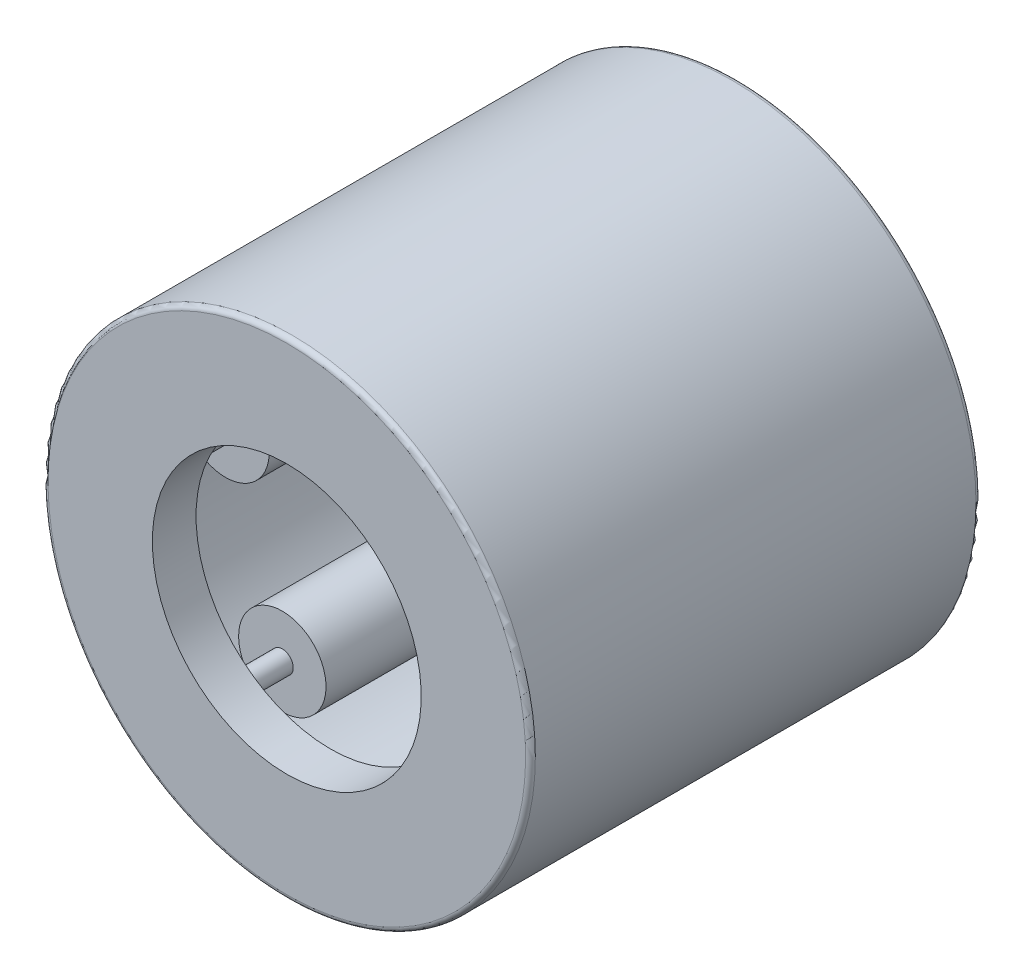
ISO-10303-21;
HEADER;
FILE_DESCRIPTION(('STEP AP214'),'2;1');
FILE_NAME('part.step','',(''),(''),'','','');
FILE_SCHEMA(('AUTOMOTIVE_DESIGN { 1 0 10303 214 1 1 1 1 }'));
ENDSEC;
DATA;
#1=APPLICATION_CONTEXT('core data for automotive mechanical design processes');
#2=APPLICATION_PROTOCOL_DEFINITION('international standard','automotive_design',2000,#1);
#3=PRODUCT_CONTEXT('',#1,'mechanical');
#4=PRODUCT('Part','Part','',(#3));
#5=PRODUCT_RELATED_PRODUCT_CATEGORY('part','',(#4));
#6=PRODUCT_DEFINITION_FORMATION('','',#4);
#7=PRODUCT_DEFINITION_CONTEXT('part definition',#1,'design');
#8=PRODUCT_DEFINITION('design','',#6,#7);
#9=PRODUCT_DEFINITION_SHAPE('','',#8);
#10=(LENGTH_UNIT() NAMED_UNIT(*) SI_UNIT(.MILLI.,.METRE.));
#11=(NAMED_UNIT(*) PLANE_ANGLE_UNIT() SI_UNIT($,.RADIAN.));
#12=(NAMED_UNIT(*) SI_UNIT($,.STERADIAN.) SOLID_ANGLE_UNIT());
#13=UNCERTAINTY_MEASURE_WITH_UNIT(LENGTH_MEASURE(1.E-05),#10,'distance_accuracy_value','');
#14=(GEOMETRIC_REPRESENTATION_CONTEXT(3) GLOBAL_UNCERTAINTY_ASSIGNED_CONTEXT((#13)) GLOBAL_UNIT_ASSIGNED_CONTEXT((#10,
#11,#12)) REPRESENTATION_CONTEXT('',''));
#15=CARTESIAN_POINT('',(0.,0.,0.));
#16=DIRECTION('',(0.,0.,1.));
#17=DIRECTION('',(1.,0.,0.));
#18=AXIS2_PLACEMENT_3D('',#15,#16,#17);
#19=CARTESIAN_POINT('',(-2.53393157824905,0.823324278679681,-1.83566666666667));
#20=DIRECTION('',(0.,0.,1.));
#21=DIRECTION('',(0.95105651629515,-0.309016994374958,0.));
#22=AXIS2_PLACEMENT_3D('',#19,#20,#21);
#23=PLANE('',#22);
#24=CARTESIAN_POINT('',(-1.98025817634588,0.643424885121059,-1.83566666666667));
#25=DIRECTION('',(0.,0.,1.));
#26=DIRECTION('',(0.95105651629515,-0.309016994374958,0.));
#27=AXIS2_PLACEMENT_3D('',#24,#25,#26);
#28=CIRCLE('',#27,0.582166666666668);
#29=CARTESIAN_POINT('',(-1.42658477444272,0.463525491562437,-1.83566666666667));
#30=VERTEX_POINT('',#29);
#31=EDGE_CURVE('E11',#30,#30,#28,.T.);
#32=ORIENTED_EDGE('',*,*,#31,.F.);
#33=EDGE_LOOP('',(#32));
#34=FACE_BOUND('',#33,.T.);
#35=CARTESIAN_POINT('',(-1.98025817634588,0.643424885121059,-1.83566666666667));
#36=DIRECTION('',(0.,0.,1.));
#37=DIRECTION('',(0.95105651629515,-0.309016994374958,0.));
#38=AXIS2_PLACEMENT_3D('',#35,#36,#37);
#39=CIRCLE('',#38,0.145541666666667);
#40=CARTESIAN_POINT('',(-1.84183982587009,0.598450036731403,-1.83566666666667));
#41=VERTEX_POINT('',#40);
#42=EDGE_CURVE('E61',#41,#41,#39,.T.);
#43=ORIENTED_EDGE('',*,*,#42,.T.);
#44=EDGE_LOOP('',(#43));
#45=FACE_BOUND('',#44,.T.);
#46=ADVANCED_FACE('F47',(#34,#45),#23,.F.);
#47=CARTESIAN_POINT('',(-1.98025817634588,0.643424885121059,1.83566666666667));
#48=DIRECTION('',(0.,0.,1.));
#49=DIRECTION('',(0.95105651629515,-0.309016994374958,0.));
#50=AXIS2_PLACEMENT_3D('',#47,#48,#49);
#51=CYLINDRICAL_SURFACE('',#50,0.582166666666668);
#52=CARTESIAN_POINT('',(-1.98025817634588,0.643424885121059,1.83566666666667));
#53=DIRECTION('',(0.,0.,1.));
#54=DIRECTION('',(0.95105651629515,-0.309016994374958,0.));
#55=AXIS2_PLACEMENT_3D('',#52,#53,#54);
#56=CIRCLE('',#55,0.582166666666668);
#57=CARTESIAN_POINT('',(-1.42658477444272,0.463525491562437,1.83566666666667));
#58=VERTEX_POINT('',#57);
#59=EDGE_CURVE('E53',#58,#58,#56,.T.);
#60=ORIENTED_EDGE('',*,*,#59,.F.);
#61=EDGE_LOOP('',(#60));
#62=FACE_BOUND('',#61,.T.);
#63=ORIENTED_EDGE('',*,*,#31,.T.);
#64=EDGE_LOOP('',(#63));
#65=FACE_BOUND('',#64,.T.);
#66=ADVANCED_FACE('F76',(#62,#65),#51,.T.);
#67=CARTESIAN_POINT('',(-2.53393157824905,0.82332427867968,1.83566666666667));
#68=DIRECTION('',(0.,0.,-1.));
#69=DIRECTION('',(-0.95105651629515,0.309016994374958,0.));
#70=AXIS2_PLACEMENT_3D('',#67,#68,#69);
#71=PLANE('',#70);
#72=CARTESIAN_POINT('',(-1.98025817634588,0.643424885121059,1.83566666666667));
#73=DIRECTION('',(0.,0.,1.));
#74=DIRECTION('',(0.95105651629515,-0.309016994374958,0.));
#75=AXIS2_PLACEMENT_3D('',#72,#73,#74);
#76=CIRCLE('',#75,0.145541666666667);
#77=CARTESIAN_POINT('',(-1.84183982587009,0.598450036731403,1.83566666666667));
#78=VERTEX_POINT('',#77);
#79=EDGE_CURVE('E57',#78,#78,#76,.T.);
#80=ORIENTED_EDGE('',*,*,#79,.F.);
#81=EDGE_LOOP('',(#80));
#82=FACE_BOUND('',#81,.T.);
#83=ORIENTED_EDGE('',*,*,#59,.T.);
#84=EDGE_LOOP('',(#83));
#85=FACE_BOUND('',#84,.T.);
#86=ADVANCED_FACE('F71',(#82,#85),#71,.F.);
#87=CARTESIAN_POINT('',(-1.98025817634588,0.643424885121059,1.83566666666667));
#88=DIRECTION('',(0.,0.,1.));
#89=DIRECTION('',(0.95105651629515,-0.309016994374958,0.));
#90=AXIS2_PLACEMENT_3D('',#87,#88,#89);
#91=CYLINDRICAL_SURFACE('',#90,0.145541666666667);
#92=ORIENTED_EDGE('',*,*,#42,.F.);
#93=EDGE_LOOP('',(#92));
#94=FACE_BOUND('',#93,.T.);
#95=ORIENTED_EDGE('',*,*,#79,.T.);
#96=EDGE_LOOP('',(#95));
#97=FACE_BOUND('',#96,.T.);
#98=ADVANCED_FACE('F68',(#94,#97),#91,.F.);
#99=CLOSED_SHELL('',(#46,#66,#86,#98));
#100=MANIFOLD_SOLID_BREP('B2',#99);
#101=CARTESIAN_POINT('',(-1.5660558405246,-2.15549094534631,-1.83566666666667));
#102=DIRECTION('',(0.,0.,1.));
#103=DIRECTION('',(0.58778525229248,0.809016994374942,0.));
#104=AXIS2_PLACEMENT_3D('',#101,#102,#103);
#105=PLANE('',#104);
#106=CARTESIAN_POINT('',(-1.22386685948166,-1.68450821845436,-1.83566666666667));
#107=DIRECTION('',(0.,0.,1.));
#108=DIRECTION('',(0.58778525229248,0.809016994374942,0.));
#109=AXIS2_PLACEMENT_3D('',#106,#107,#108);
#110=CIRCLE('',#109,0.582166666666668);
#111=CARTESIAN_POINT('',(-0.881677878438719,-1.21352549156241,-1.83566666666667));
#112=VERTEX_POINT('',#111);
#113=EDGE_CURVE('E46',#112,#112,#110,.T.);
#114=ORIENTED_EDGE('',*,*,#113,.F.);
#115=EDGE_LOOP('',(#114));
#116=FACE_BOUND('',#115,.T.);
#117=CARTESIAN_POINT('',(-1.22386685948166,-1.68450821845436,-1.83566666666667));
#118=DIRECTION('',(0.,0.,1.));
#119=DIRECTION('',(0.58778525229248,0.809016994374942,0.));
#120=AXIS2_PLACEMENT_3D('',#117,#118,#119);
#121=CIRCLE('',#120,0.145541666666667);
#122=CARTESIAN_POINT('',(-1.13831961422092,-1.56676253673137,-1.83566666666667));
#123=VERTEX_POINT('',#122);
#124=EDGE_CURVE('E138',#123,#123,#121,.T.);
#125=ORIENTED_EDGE('',*,*,#124,.T.);
#126=EDGE_LOOP('',(#125));
#127=FACE_BOUND('',#126,.T.);
#128=ADVANCED_FACE('F124',(#116,#127),#105,.F.);
#129=CARTESIAN_POINT('',(-1.22386685948166,-1.68450821845436,1.83566666666667));
#130=DIRECTION('',(0.,0.,1.));
#131=DIRECTION('',(0.58778525229248,0.809016994374942,0.));
#132=AXIS2_PLACEMENT_3D('',#129,#130,#131);
#133=CYLINDRICAL_SURFACE('',#132,0.582166666666668);
#134=CARTESIAN_POINT('',(-1.22386685948166,-1.68450821845436,1.83566666666667));
#135=DIRECTION('',(0.,0.,1.));
#136=DIRECTION('',(0.58778525229248,0.809016994374942,0.));
#137=AXIS2_PLACEMENT_3D('',#134,#135,#136);
#138=CIRCLE('',#137,0.582166666666668);
#139=CARTESIAN_POINT('',(-0.881677878438719,-1.21352549156241,1.83566666666667));
#140=VERTEX_POINT('',#139);
#141=EDGE_CURVE('E130',#140,#140,#138,.T.);
#142=ORIENTED_EDGE('',*,*,#141,.F.);
#143=EDGE_LOOP('',(#142));
#144=FACE_BOUND('',#143,.T.);
#145=ORIENTED_EDGE('',*,*,#113,.T.);
#146=EDGE_LOOP('',(#145));
#147=FACE_BOUND('',#146,.T.);
#148=ADVANCED_FACE('F153',(#144,#147),#133,.T.);
#149=CARTESIAN_POINT('',(-1.5660558405246,-2.1554909453463,1.83566666666667));
#150=DIRECTION('',(0.,0.,-1.));
#151=DIRECTION('',(-0.58778525229248,-0.809016994374942,0.));
#152=AXIS2_PLACEMENT_3D('',#149,#150,#151);
#153=PLANE('',#152);
#154=CARTESIAN_POINT('',(-1.22386685948166,-1.68450821845436,1.83566666666667));
#155=DIRECTION('',(0.,0.,1.));
#156=DIRECTION('',(0.58778525229248,0.809016994374942,0.));
#157=AXIS2_PLACEMENT_3D('',#154,#155,#156);
#158=CIRCLE('',#157,0.145541666666667);
#159=CARTESIAN_POINT('',(-1.13831961422092,-1.56676253673137,1.83566666666667));
#160=VERTEX_POINT('',#159);
#161=EDGE_CURVE('E134',#160,#160,#158,.T.);
#162=ORIENTED_EDGE('',*,*,#161,.F.);
#163=EDGE_LOOP('',(#162));
#164=FACE_BOUND('',#163,.T.);
#165=ORIENTED_EDGE('',*,*,#141,.T.);
#166=EDGE_LOOP('',(#165));
#167=FACE_BOUND('',#166,.T.);
#168=ADVANCED_FACE('F148',(#164,#167),#153,.F.);
#169=CARTESIAN_POINT('',(-1.22386685948166,-1.68450821845436,1.83566666666667));
#170=DIRECTION('',(0.,0.,1.));
#171=DIRECTION('',(0.58778525229248,0.809016994374942,0.));
#172=AXIS2_PLACEMENT_3D('',#169,#170,#171);
#173=CYLINDRICAL_SURFACE('',#172,0.145541666666667);
#174=ORIENTED_EDGE('',*,*,#124,.F.);
#175=EDGE_LOOP('',(#174));
#176=FACE_BOUND('',#175,.T.);
#177=ORIENTED_EDGE('',*,*,#161,.T.);
#178=EDGE_LOOP('',(#177));
#179=FACE_BOUND('',#178,.T.);
#180=ADVANCED_FACE('F145',(#176,#179),#173,.F.);
#181=CLOSED_SHELL('',(#128,#148,#168,#180));
#182=MANIFOLD_SOLID_BREP('B6',#181);
#183=CARTESIAN_POINT('',(1.56605584052457,-2.15549094534633,-1.83566666666667));
#184=DIRECTION('',(0.,0.,1.));
#185=DIRECTION('',(-0.587785252292469,0.809016994374951,0.));
#186=AXIS2_PLACEMENT_3D('',#183,#184,#185);
#187=PLANE('',#186);
#188=CARTESIAN_POINT('',(1.22386685948163,-1.68450821845438,-1.83566666666667));
#189=DIRECTION('',(0.,0.,1.));
#190=DIRECTION('',(-0.587785252292469,0.809016994374951,0.));
#191=AXIS2_PLACEMENT_3D('',#188,#189,#190);
#192=CIRCLE('',#191,0.582166666666668);
#193=CARTESIAN_POINT('',(0.881677878438702,-1.21352549156242,-1.83566666666667));
#194=VERTEX_POINT('',#193);
#195=EDGE_CURVE('E123',#194,#194,#192,.T.);
#196=ORIENTED_EDGE('',*,*,#195,.F.);
#197=EDGE_LOOP('',(#196));
#198=FACE_BOUND('',#197,.T.);
#199=CARTESIAN_POINT('',(1.22386685948163,-1.68450821845438,-1.83566666666667));
#200=DIRECTION('',(0.,0.,1.));
#201=DIRECTION('',(-0.587785252292469,0.809016994374951,0.));
#202=AXIS2_PLACEMENT_3D('',#199,#200,#201);
#203=CIRCLE('',#202,0.145541666666667);
#204=CARTESIAN_POINT('',(1.1383196142209,-1.56676253673139,-1.83566666666667));
#205=VERTEX_POINT('',#204);
#206=EDGE_CURVE('E215',#205,#205,#203,.T.);
#207=ORIENTED_EDGE('',*,*,#206,.T.);
#208=EDGE_LOOP('',(#207));
#209=FACE_BOUND('',#208,.T.);
#210=ADVANCED_FACE('F201',(#198,#209),#187,.F.);
#211=CARTESIAN_POINT('',(1.22386685948163,-1.68450821845438,1.83566666666667));
#212=DIRECTION('',(0.,0.,1.));
#213=DIRECTION('',(-0.587785252292469,0.809016994374951,0.));
#214=AXIS2_PLACEMENT_3D('',#211,#212,#213);
#215=CYLINDRICAL_SURFACE('',#214,0.582166666666668);
#216=CARTESIAN_POINT('',(1.22386685948163,-1.68450821845438,1.83566666666667));
#217=DIRECTION('',(0.,0.,1.));
#218=DIRECTION('',(-0.587785252292469,0.809016994374951,0.));
#219=AXIS2_PLACEMENT_3D('',#216,#217,#218);
#220=CIRCLE('',#219,0.582166666666668);
#221=CARTESIAN_POINT('',(0.881677878438701,-1.21352549156242,1.83566666666667));
#222=VERTEX_POINT('',#221);
#223=EDGE_CURVE('E207',#222,#222,#220,.T.);
#224=ORIENTED_EDGE('',*,*,#223,.F.);
#225=EDGE_LOOP('',(#224));
#226=FACE_BOUND('',#225,.T.);
#227=ORIENTED_EDGE('',*,*,#195,.T.);
#228=EDGE_LOOP('',(#227));
#229=FACE_BOUND('',#228,.T.);
#230=ADVANCED_FACE('F230',(#226,#229),#215,.T.);
#231=CARTESIAN_POINT('',(1.56605584052457,-2.15549094534633,1.83566666666667));
#232=DIRECTION('',(0.,0.,-1.));
#233=DIRECTION('',(0.587785252292469,-0.809016994374951,0.));
#234=AXIS2_PLACEMENT_3D('',#231,#232,#233);
#235=PLANE('',#234);
#236=CARTESIAN_POINT('',(1.22386685948163,-1.68450821845438,1.83566666666667));
#237=DIRECTION('',(0.,0.,1.));
#238=DIRECTION('',(-0.587785252292469,0.809016994374951,0.));
#239=AXIS2_PLACEMENT_3D('',#236,#237,#238);
#240=CIRCLE('',#239,0.145541666666667);
#241=CARTESIAN_POINT('',(1.1383196142209,-1.56676253673139,1.83566666666667));
#242=VERTEX_POINT('',#241);
#243=EDGE_CURVE('E211',#242,#242,#240,.T.);
#244=ORIENTED_EDGE('',*,*,#243,.F.);
#245=EDGE_LOOP('',(#244));
#246=FACE_BOUND('',#245,.T.);
#247=ORIENTED_EDGE('',*,*,#223,.T.);
#248=EDGE_LOOP('',(#247));
#249=FACE_BOUND('',#248,.T.);
#250=ADVANCED_FACE('F225',(#246,#249),#235,.F.);
#251=CARTESIAN_POINT('',(1.22386685948163,-1.68450821845438,1.83566666666667));
#252=DIRECTION('',(0.,0.,1.));
#253=DIRECTION('',(-0.587785252292469,0.809016994374951,0.));
#254=AXIS2_PLACEMENT_3D('',#251,#252,#253);
#255=CYLINDRICAL_SURFACE('',#254,0.145541666666667);
#256=ORIENTED_EDGE('',*,*,#206,.F.);
#257=EDGE_LOOP('',(#256));
#258=FACE_BOUND('',#257,.T.);
#259=ORIENTED_EDGE('',*,*,#243,.T.);
#260=EDGE_LOOP('',(#259));
#261=FACE_BOUND('',#260,.T.);
#262=ADVANCED_FACE('F222',(#258,#261),#255,.F.);
#263=CLOSED_SHELL('',(#210,#230,#250,#262));
#264=MANIFOLD_SOLID_BREP('B41',#263);
#265=CARTESIAN_POINT('',(2.53393157824906,0.823324278679645,-1.83566666666667));
#266=DIRECTION('',(0.,0.,1.));
#267=DIRECTION('',(-0.951056516295155,-0.309016994374945,0.));
#268=AXIS2_PLACEMENT_3D('',#265,#266,#267);
#269=PLANE('',#268);
#270=CARTESIAN_POINT('',(1.98025817634589,0.643424885121031,-1.83566666666667));
#271=DIRECTION('',(0.,0.,1.));
#272=DIRECTION('',(-0.951056516295155,-0.309016994374945,0.));
#273=AXIS2_PLACEMENT_3D('',#270,#271,#272);
#274=CIRCLE('',#273,0.582166666666668);
#275=CARTESIAN_POINT('',(1.42658477444273,0.463525491562417,-1.83566666666667));
#276=VERTEX_POINT('',#275);
#277=EDGE_CURVE('E200',#276,#276,#274,.T.);
#278=ORIENTED_EDGE('',*,*,#277,.F.);
#279=EDGE_LOOP('',(#278));
#280=FACE_BOUND('',#279,.T.);
#281=CARTESIAN_POINT('',(1.98025817634589,0.643424885121031,-1.83566666666667));
#282=DIRECTION('',(0.,0.,1.));
#283=DIRECTION('',(-0.951056516295155,-0.309016994374945,0.));
#284=AXIS2_PLACEMENT_3D('',#281,#282,#283);
#285=CIRCLE('',#284,0.145541666666667);
#286=CARTESIAN_POINT('',(1.8418398258701,0.598450036731377,-1.83566666666667));
#287=VERTEX_POINT('',#286);
#288=EDGE_CURVE('E292',#287,#287,#285,.T.);
#289=ORIENTED_EDGE('',*,*,#288,.T.);
#290=EDGE_LOOP('',(#289));
#291=FACE_BOUND('',#290,.T.);
#292=ADVANCED_FACE('F278',(#280,#291),#269,.F.);
#293=CARTESIAN_POINT('',(1.98025817634589,0.643424885121031,1.83566666666667));
#294=DIRECTION('',(0.,0.,1.));
#295=DIRECTION('',(-0.951056516295155,-0.309016994374945,0.));
#296=AXIS2_PLACEMENT_3D('',#293,#294,#295);
#297=CYLINDRICAL_SURFACE('',#296,0.582166666666668);
#298=CARTESIAN_POINT('',(1.98025817634589,0.643424885121031,1.83566666666667));
#299=DIRECTION('',(0.,0.,1.));
#300=DIRECTION('',(-0.951056516295155,-0.309016994374945,0.));
#301=AXIS2_PLACEMENT_3D('',#298,#299,#300);
#302=CIRCLE('',#301,0.582166666666668);
#303=CARTESIAN_POINT('',(1.42658477444273,0.463525491562417,1.83566666666667));
#304=VERTEX_POINT('',#303);
#305=EDGE_CURVE('E284',#304,#304,#302,.T.);
#306=ORIENTED_EDGE('',*,*,#305,.F.);
#307=EDGE_LOOP('',(#306));
#308=FACE_BOUND('',#307,.T.);
#309=ORIENTED_EDGE('',*,*,#277,.T.);
#310=EDGE_LOOP('',(#309));
#311=FACE_BOUND('',#310,.T.);
#312=ADVANCED_FACE('F307',(#308,#311),#297,.T.);
#313=CARTESIAN_POINT('',(2.53393157824906,0.823324278679645,1.83566666666667));
#314=DIRECTION('',(0.,0.,-1.));
#315=DIRECTION('',(0.951056516295155,0.309016994374945,0.));
#316=AXIS2_PLACEMENT_3D('',#313,#314,#315);
#317=PLANE('',#316);
#318=CARTESIAN_POINT('',(1.98025817634589,0.643424885121031,1.83566666666667));
#319=DIRECTION('',(0.,0.,1.));
#320=DIRECTION('',(-0.951056516295155,-0.309016994374945,0.));
#321=AXIS2_PLACEMENT_3D('',#318,#319,#320);
#322=CIRCLE('',#321,0.145541666666667);
#323=CARTESIAN_POINT('',(1.8418398258701,0.598450036731377,1.83566666666667));
#324=VERTEX_POINT('',#323);
#325=EDGE_CURVE('E288',#324,#324,#322,.T.);
#326=ORIENTED_EDGE('',*,*,#325,.F.);
#327=EDGE_LOOP('',(#326));
#328=FACE_BOUND('',#327,.T.);
#329=ORIENTED_EDGE('',*,*,#305,.T.);
#330=EDGE_LOOP('',(#329));
#331=FACE_BOUND('',#330,.T.);
#332=ADVANCED_FACE('F302',(#328,#331),#317,.F.);
#333=CARTESIAN_POINT('',(1.98025817634589,0.643424885121031,1.83566666666667));
#334=DIRECTION('',(0.,0.,1.));
#335=DIRECTION('',(-0.951056516295155,-0.309016994374945,0.));
#336=AXIS2_PLACEMENT_3D('',#333,#334,#335);
#337=CYLINDRICAL_SURFACE('',#336,0.145541666666667);
#338=ORIENTED_EDGE('',*,*,#288,.F.);
#339=EDGE_LOOP('',(#338));
#340=FACE_BOUND('',#339,.T.);
#341=ORIENTED_EDGE('',*,*,#325,.T.);
#342=EDGE_LOOP('',(#341));
#343=FACE_BOUND('',#342,.T.);
#344=ADVANCED_FACE('F299',(#340,#343),#337,.F.);
#345=CLOSED_SHELL('',(#292,#312,#332,#344));
#346=MANIFOLD_SOLID_BREP('B118',#345);
#347=CARTESIAN_POINT('',(-1.98025817634589,0.643424885121059,2.41783333333333));
#348=DIRECTION('',(0.,0.,-1.));
#349=DIRECTION('',(-0.309016994374958,-0.95105651629515,0.));
#350=AXIS2_PLACEMENT_3D('',#347,#348,#349);
#351=PLANE('',#350);
#352=CARTESIAN_POINT('',(-1.98025817634589,0.643424885121059,2.41783333333333));
#353=DIRECTION('',(0.,0.,1.));
#354=DIRECTION('',(0.309016994374958,0.95105651629515,0.));
#355=AXIS2_PLACEMENT_3D('',#352,#353,#354);
#356=CIRCLE('',#355,0.145541666666665);
#357=CARTESIAN_POINT('',(-1.93528332795623,0.781843235596848,2.41783333333333));
#358=VERTEX_POINT('',#357);
#359=EDGE_CURVE('E277',#358,#358,#356,.T.);
#360=ORIENTED_EDGE('',*,*,#359,.T.);
#361=EDGE_LOOP('',(#360));
#362=FACE_BOUND('',#361,.T.);
#363=ADVANCED_FACE('F355',(#362),#351,.F.);
#364=CARTESIAN_POINT('',(-1.98025817634589,0.643424885121059,2.41783333333333));
#365=DIRECTION('',(0.,0.,1.));
#366=DIRECTION('',(0.309016994374958,0.95105651629515,0.));
#367=AXIS2_PLACEMENT_3D('',#364,#365,#366);
#368=CYLINDRICAL_SURFACE('',#367,0.145541666666666);
#369=ORIENTED_EDGE('',*,*,#359,.F.);
#370=EDGE_LOOP('',(#369));
#371=FACE_BOUND('',#370,.T.);
#372=CARTESIAN_POINT('',(-1.98025817634589,0.643424885121059,-2.41783333333333));
#373=DIRECTION('',(0.,0.,1.));
#374=DIRECTION('',(0.309016994374958,0.95105651629515,0.));
#375=AXIS2_PLACEMENT_3D('',#372,#373,#374);
#376=CIRCLE('',#375,0.145541666666666);
#377=CARTESIAN_POINT('',(-1.93528332795623,0.781843235596849,-2.41783333333333));
#378=VERTEX_POINT('',#377);
#379=EDGE_CURVE('E361',#378,#378,#376,.T.);
#380=ORIENTED_EDGE('',*,*,#379,.T.);
#381=EDGE_LOOP('',(#380));
#382=FACE_BOUND('',#381,.T.);
#383=ADVANCED_FACE('F367',(#371,#382),#368,.T.);
#384=CARTESIAN_POINT('',(-1.98025817634589,0.643424885121059,-2.41783333333333));
#385=DIRECTION('',(0.,0.,1.));
#386=DIRECTION('',(0.309016994374958,0.95105651629515,0.));
#387=AXIS2_PLACEMENT_3D('',#384,#385,#386);
#388=PLANE('',#387);
#389=ORIENTED_EDGE('',*,*,#379,.F.);
#390=EDGE_LOOP('',(#389));
#391=FACE_BOUND('',#390,.T.);
#392=ADVANCED_FACE('F369',(#391),#388,.F.);
#393=CLOSED_SHELL('',(#363,#383,#392));
#394=MANIFOLD_SOLID_BREP('B195',#393);
#395=CARTESIAN_POINT('',(-1.22386685948166,-1.68450821845436,2.41783333333333));
#396=DIRECTION('',(0.,0.,-1.));
#397=DIRECTION('',(0.809016994374942,-0.58778525229248,0.));
#398=AXIS2_PLACEMENT_3D('',#395,#396,#397);
#399=PLANE('',#398);
#400=CARTESIAN_POINT('',(-1.22386685948166,-1.68450821845436,2.41783333333333));
#401=DIRECTION('',(0.,0.,1.));
#402=DIRECTION('',(-0.809016994374942,0.58778525229248,0.));
#403=AXIS2_PLACEMENT_3D('',#400,#401,#402);
#404=CIRCLE('',#403,0.145541666666665);
#405=CARTESIAN_POINT('',(-1.34161254120464,-1.59896097319363,2.41783333333333));
#406=VERTEX_POINT('',#405);
#407=EDGE_CURVE('E354',#406,#406,#404,.T.);
#408=ORIENTED_EDGE('',*,*,#407,.T.);
#409=EDGE_LOOP('',(#408));
#410=FACE_BOUND('',#409,.T.);
#411=ADVANCED_FACE('F409',(#410),#399,.F.);
#412=CARTESIAN_POINT('',(-1.22386685948166,-1.68450821845436,2.41783333333333));
#413=DIRECTION('',(0.,0.,1.));
#414=DIRECTION('',(-0.809016994374942,0.58778525229248,0.));
#415=AXIS2_PLACEMENT_3D('',#412,#413,#414);
#416=CYLINDRICAL_SURFACE('',#415,0.145541666666666);
#417=ORIENTED_EDGE('',*,*,#407,.F.);
#418=EDGE_LOOP('',(#417));
#419=FACE_BOUND('',#418,.T.);
#420=CARTESIAN_POINT('',(-1.22386685948166,-1.68450821845436,-2.41783333333333));
#421=DIRECTION('',(0.,0.,1.));
#422=DIRECTION('',(-0.809016994374942,0.58778525229248,0.));
#423=AXIS2_PLACEMENT_3D('',#420,#421,#422);
#424=CIRCLE('',#423,0.145541666666666);
#425=CARTESIAN_POINT('',(-1.34161254120465,-1.59896097319362,-2.41783333333333));
#426=VERTEX_POINT('',#425);
#427=EDGE_CURVE('E415',#426,#426,#424,.T.);
#428=ORIENTED_EDGE('',*,*,#427,.T.);
#429=EDGE_LOOP('',(#428));
#430=FACE_BOUND('',#429,.T.);
#431=ADVANCED_FACE('F421',(#419,#430),#416,.T.);
#432=CARTESIAN_POINT('',(-1.22386685948166,-1.68450821845436,-2.41783333333333));
#433=DIRECTION('',(0.,0.,1.));
#434=DIRECTION('',(-0.809016994374942,0.58778525229248,0.));
#435=AXIS2_PLACEMENT_3D('',#432,#433,#434);
#436=PLANE('',#435);
#437=ORIENTED_EDGE('',*,*,#427,.F.);
#438=EDGE_LOOP('',(#437));
#439=FACE_BOUND('',#438,.T.);
#440=ADVANCED_FACE('F423',(#439),#436,.F.);
#441=CLOSED_SHELL('',(#411,#431,#440));
#442=MANIFOLD_SOLID_BREP('B272',#441);
#443=CARTESIAN_POINT('',(1.22386685948164,-1.68450821845438,2.41783333333333));
#444=DIRECTION('',(0.,0.,-1.));
#445=DIRECTION('',(0.809016994374951,0.587785252292469,0.));
#446=AXIS2_PLACEMENT_3D('',#443,#444,#445);
#447=PLANE('',#446);
#448=CARTESIAN_POINT('',(1.22386685948164,-1.68450821845438,2.41783333333333));
#449=DIRECTION('',(0.,0.,1.));
#450=DIRECTION('',(-0.809016994374951,-0.587785252292469,0.));
#451=AXIS2_PLACEMENT_3D('',#448,#449,#450);
#452=CIRCLE('',#451,0.145541666666665);
#453=CARTESIAN_POINT('',(1.10612117775865,-1.77005546371511,2.41783333333333));
#454=VERTEX_POINT('',#453);
#455=EDGE_CURVE('E408',#454,#454,#452,.T.);
#456=ORIENTED_EDGE('',*,*,#455,.T.);
#457=EDGE_LOOP('',(#456));
#458=FACE_BOUND('',#457,.T.);
#459=ADVANCED_FACE('F463',(#458),#447,.F.);
#460=CARTESIAN_POINT('',(1.22386685948164,-1.68450821845438,2.41783333333333));
#461=DIRECTION('',(0.,0.,1.));
#462=DIRECTION('',(-0.809016994374951,-0.587785252292469,0.));
#463=AXIS2_PLACEMENT_3D('',#460,#461,#462);
#464=CYLINDRICAL_SURFACE('',#463,0.145541666666666);
#465=ORIENTED_EDGE('',*,*,#455,.F.);
#466=EDGE_LOOP('',(#465));
#467=FACE_BOUND('',#466,.T.);
#468=CARTESIAN_POINT('',(1.22386685948164,-1.68450821845438,-2.41783333333333));
#469=DIRECTION('',(0.,0.,1.));
#470=DIRECTION('',(-0.809016994374951,-0.587785252292469,0.));
#471=AXIS2_PLACEMENT_3D('',#468,#469,#470);
#472=CIRCLE('',#471,0.145541666666666);
#473=CARTESIAN_POINT('',(1.10612117775865,-1.77005546371511,-2.41783333333333));
#474=VERTEX_POINT('',#473);
#475=EDGE_CURVE('E469',#474,#474,#472,.T.);
#476=ORIENTED_EDGE('',*,*,#475,.T.);
#477=EDGE_LOOP('',(#476));
#478=FACE_BOUND('',#477,.T.);
#479=ADVANCED_FACE('F475',(#467,#478),#464,.T.);
#480=CARTESIAN_POINT('',(1.22386685948164,-1.68450821845438,-2.41783333333333));
#481=DIRECTION('',(0.,0.,1.));
#482=DIRECTION('',(-0.809016994374951,-0.587785252292469,0.));
#483=AXIS2_PLACEMENT_3D('',#480,#481,#482);
#484=PLANE('',#483);
#485=ORIENTED_EDGE('',*,*,#475,.F.);
#486=EDGE_LOOP('',(#485));
#487=FACE_BOUND('',#486,.T.);
#488=ADVANCED_FACE('F477',(#487),#484,.F.);
#489=CLOSED_SHELL('',(#459,#479,#488));
#490=MANIFOLD_SOLID_BREP('B349',#489);
#491=CARTESIAN_POINT('',(1.98025817634589,0.643424885121031,2.41783333333333));
#492=DIRECTION('',(0.,0.,-1.));
#493=DIRECTION('',(-0.309016994374945,0.951056516295155,0.));
#494=AXIS2_PLACEMENT_3D('',#491,#492,#493);
#495=PLANE('',#494);
#496=CARTESIAN_POINT('',(1.98025817634589,0.643424885121031,2.41783333333333));
#497=DIRECTION('',(0.,0.,1.));
#498=DIRECTION('',(0.309016994374945,-0.951056516295155,0.));
#499=AXIS2_PLACEMENT_3D('',#496,#497,#498);
#500=CIRCLE('',#499,0.145541666666665);
#501=CARTESIAN_POINT('',(2.02523302473555,0.505006534645242,2.41783333333333));
#502=VERTEX_POINT('',#501);
#503=EDGE_CURVE('E462',#502,#502,#500,.T.);
#504=ORIENTED_EDGE('',*,*,#503,.T.);
#505=EDGE_LOOP('',(#504));
#506=FACE_BOUND('',#505,.T.);
#507=ADVANCED_FACE('F517',(#506),#495,.F.);
#508=CARTESIAN_POINT('',(1.98025817634589,0.643424885121031,2.41783333333333));
#509=DIRECTION('',(0.,0.,1.));
#510=DIRECTION('',(0.309016994374945,-0.951056516295155,0.));
#511=AXIS2_PLACEMENT_3D('',#508,#509,#510);
#512=CYLINDRICAL_SURFACE('',#511,0.145541666666666);
#513=ORIENTED_EDGE('',*,*,#503,.F.);
#514=EDGE_LOOP('',(#513));
#515=FACE_BOUND('',#514,.T.);
#516=CARTESIAN_POINT('',(1.98025817634589,0.643424885121031,-2.41783333333333));
#517=DIRECTION('',(0.,0.,1.));
#518=DIRECTION('',(0.309016994374945,-0.951056516295155,0.));
#519=AXIS2_PLACEMENT_3D('',#516,#517,#518);
#520=CIRCLE('',#519,0.145541666666666);
#521=CARTESIAN_POINT('',(2.02523302473555,0.505006534645241,-2.41783333333333));
#522=VERTEX_POINT('',#521);
#523=EDGE_CURVE('E523',#522,#522,#520,.T.);
#524=ORIENTED_EDGE('',*,*,#523,.T.);
#525=EDGE_LOOP('',(#524));
#526=FACE_BOUND('',#525,.T.);
#527=ADVANCED_FACE('F529',(#515,#526),#512,.T.);
#528=CARTESIAN_POINT('',(1.98025817634589,0.643424885121031,-2.41783333333333));
#529=DIRECTION('',(0.,0.,1.));
#530=DIRECTION('',(0.309016994374945,-0.951056516295155,0.));
#531=AXIS2_PLACEMENT_3D('',#528,#529,#530);
#532=PLANE('',#531);
#533=ORIENTED_EDGE('',*,*,#523,.F.);
#534=EDGE_LOOP('',(#533));
#535=FACE_BOUND('',#534,.T.);
#536=ADVANCED_FACE('F531',(#535),#532,.F.);
#537=CLOSED_SHELL('',(#507,#527,#536));
#538=MANIFOLD_SOLID_BREP('B403',#537);
#539=CARTESIAN_POINT('',(0.,2.08216666666667,2.41783333333333));
#540=DIRECTION('',(0.,0.,-1.));
#541=DIRECTION('',(-1.,0.,0.));
#542=AXIS2_PLACEMENT_3D('',#539,#540,#541);
#543=PLANE('',#542);
#544=CARTESIAN_POINT('',(0.,2.08216666666667,2.41783333333333));
#545=DIRECTION('',(0.,0.,1.));
#546=DIRECTION('',(1.,0.,0.));
#547=AXIS2_PLACEMENT_3D('',#544,#545,#546);
#548=CIRCLE('',#547,0.145541666666665);
#549=CARTESIAN_POINT('',(0.145541666666665,2.08216666666667,2.41783333333333));
#550=VERTEX_POINT('',#549);
#551=EDGE_CURVE('E516',#550,#550,#548,.T.);
#552=ORIENTED_EDGE('',*,*,#551,.T.);
#553=EDGE_LOOP('',(#552));
#554=FACE_BOUND('',#553,.T.);
#555=ADVANCED_FACE('F571',(#554),#543,.F.);
#556=CARTESIAN_POINT('',(0.,2.08216666666667,2.41783333333333));
#557=DIRECTION('',(0.,0.,1.));
#558=DIRECTION('',(1.,0.,0.));
#559=AXIS2_PLACEMENT_3D('',#556,#557,#558);
#560=CYLINDRICAL_SURFACE('',#559,0.145541666666666);
#561=ORIENTED_EDGE('',*,*,#551,.F.);
#562=EDGE_LOOP('',(#561));
#563=FACE_BOUND('',#562,.T.);
#564=CARTESIAN_POINT('',(0.,2.08216666666667,-2.41783333333333));
#565=DIRECTION('',(0.,0.,1.));
#566=DIRECTION('',(1.,0.,0.));
#567=AXIS2_PLACEMENT_3D('',#564,#565,#566);
#568=CIRCLE('',#567,0.145541666666666);
#569=CARTESIAN_POINT('',(0.145541666666666,2.08216666666667,-2.41783333333333));
#570=VERTEX_POINT('',#569);
#571=EDGE_CURVE('E577',#570,#570,#568,.T.);
#572=ORIENTED_EDGE('',*,*,#571,.T.);
#573=EDGE_LOOP('',(#572));
#574=FACE_BOUND('',#573,.T.);
#575=ADVANCED_FACE('F583',(#563,#574),#560,.T.);
#576=CARTESIAN_POINT('',(0.,2.08216666666667,-2.41783333333333));
#577=DIRECTION('',(0.,0.,1.));
#578=DIRECTION('',(1.,0.,0.));
#579=AXIS2_PLACEMENT_3D('',#576,#577,#578);
#580=PLANE('',#579);
#581=ORIENTED_EDGE('',*,*,#571,.F.);
#582=EDGE_LOOP('',(#581));
#583=FACE_BOUND('',#582,.T.);
#584=ADVANCED_FACE('F585',(#583),#580,.F.);
#585=CLOSED_SHELL('',(#555,#575,#584));
#586=MANIFOLD_SOLID_BREP('B457',#585);
#587=CARTESIAN_POINT('',(0.,2.66433333333333,-1.83566666666667));
#588=DIRECTION('',(0.,0.,1.));
#589=DIRECTION('',(0.,-1.,0.));
#590=AXIS2_PLACEMENT_3D('',#587,#588,#589);
#591=PLANE('',#590);
#592=CARTESIAN_POINT('',(0.,2.08216666666667,-1.83566666666667));
#593=DIRECTION('',(0.,0.,1.));
#594=DIRECTION('',(0.,-1.,0.));
#595=AXIS2_PLACEMENT_3D('',#592,#593,#594);
#596=CIRCLE('',#595,0.582166666666668);
#597=CARTESIAN_POINT('',(0.,1.5,-1.83566666666667));
#598=VERTEX_POINT('',#597);
#599=EDGE_CURVE('E570',#598,#598,#596,.T.);
#600=ORIENTED_EDGE('',*,*,#599,.F.);
#601=EDGE_LOOP('',(#600));
#602=FACE_BOUND('',#601,.T.);
#603=CARTESIAN_POINT('',(0.,2.08216666666667,-1.83566666666667));
#604=DIRECTION('',(0.,0.,1.));
#605=DIRECTION('',(0.,-1.,0.));
#606=AXIS2_PLACEMENT_3D('',#603,#604,#605);
#607=CIRCLE('',#606,0.145541666666667);
#608=CARTESIAN_POINT('',(0.,1.936625,-1.83566666666667));
#609=VERTEX_POINT('',#608);
#610=EDGE_CURVE('E638',#609,#609,#607,.T.);
#611=ORIENTED_EDGE('',*,*,#610,.T.);
#612=EDGE_LOOP('',(#611));
#613=FACE_BOUND('',#612,.T.);
#614=ADVANCED_FACE('F624',(#602,#613),#591,.F.);
#615=CARTESIAN_POINT('',(0.,2.08216666666667,1.83566666666667));
#616=DIRECTION('',(0.,0.,1.));
#617=DIRECTION('',(0.,-1.,0.));
#618=AXIS2_PLACEMENT_3D('',#615,#616,#617);
#619=CYLINDRICAL_SURFACE('',#618,0.582166666666668);
#620=CARTESIAN_POINT('',(0.,2.08216666666667,1.83566666666667));
#621=DIRECTION('',(0.,0.,1.));
#622=DIRECTION('',(0.,-1.,0.));
#623=AXIS2_PLACEMENT_3D('',#620,#621,#622);
#624=CIRCLE('',#623,0.582166666666668);
#625=CARTESIAN_POINT('',(0.,1.5,1.83566666666667));
#626=VERTEX_POINT('',#625);
#627=EDGE_CURVE('E630',#626,#626,#624,.T.);
#628=ORIENTED_EDGE('',*,*,#627,.F.);
#629=EDGE_LOOP('',(#628));
#630=FACE_BOUND('',#629,.T.);
#631=ORIENTED_EDGE('',*,*,#599,.T.);
#632=EDGE_LOOP('',(#631));
#633=FACE_BOUND('',#632,.T.);
#634=ADVANCED_FACE('F653',(#630,#633),#619,.T.);
#635=CARTESIAN_POINT('',(0.,2.66433333333333,1.83566666666667));
#636=DIRECTION('',(0.,0.,-1.));
#637=DIRECTION('',(0.,1.,0.));
#638=AXIS2_PLACEMENT_3D('',#635,#636,#637);
#639=PLANE('',#638);
#640=CARTESIAN_POINT('',(0.,2.08216666666667,1.83566666666667));
#641=DIRECTION('',(0.,0.,1.));
#642=DIRECTION('',(0.,-1.,0.));
#643=AXIS2_PLACEMENT_3D('',#640,#641,#642);
#644=CIRCLE('',#643,0.145541666666667);
#645=CARTESIAN_POINT('',(0.,1.936625,1.83566666666667));
#646=VERTEX_POINT('',#645);
#647=EDGE_CURVE('E634',#646,#646,#644,.T.);
#648=ORIENTED_EDGE('',*,*,#647,.F.);
#649=EDGE_LOOP('',(#648));
#650=FACE_BOUND('',#649,.T.);
#651=ORIENTED_EDGE('',*,*,#627,.T.);
#652=EDGE_LOOP('',(#651));
#653=FACE_BOUND('',#652,.T.);
#654=ADVANCED_FACE('F648',(#650,#653),#639,.F.);
#655=CARTESIAN_POINT('',(0.,2.08216666666667,1.83566666666667));
#656=DIRECTION('',(0.,0.,1.));
#657=DIRECTION('',(0.,-1.,0.));
#658=AXIS2_PLACEMENT_3D('',#655,#656,#657);
#659=CYLINDRICAL_SURFACE('',#658,0.145541666666667);
#660=ORIENTED_EDGE('',*,*,#610,.F.);
#661=EDGE_LOOP('',(#660));
#662=FACE_BOUND('',#661,.T.);
#663=ORIENTED_EDGE('',*,*,#647,.T.);
#664=EDGE_LOOP('',(#663));
#665=FACE_BOUND('',#664,.T.);
#666=ADVANCED_FACE('F645',(#662,#665),#659,.F.);
#667=CLOSED_SHELL('',(#614,#634,#654,#666));
#668=MANIFOLD_SOLID_BREP('B511',#667);
#669=CARTESIAN_POINT('',(0.,3.2465,3.));
#670=DIRECTION('',(0.,0.,-1.));
#671=DIRECTION('',(0.,1.,0.));
#672=AXIS2_PLACEMENT_3D('',#669,#670,#671);
#673=PLANE('',#672);
#674=CARTESIAN_POINT('',(0.,0.,3.));
#675=DIRECTION('',(0.,0.,-1.));
#676=DIRECTION('',(0.,1.,0.));
#677=AXIS2_PLACEMENT_3D('',#674,#675,#676);
#678=CIRCLE('',#677,3.18157);
#679=CARTESIAN_POINT('',(0.,3.18157,3.));
#680=VERTEX_POINT('',#679);
#681=EDGE_CURVE('E623',#680,#680,#678,.F.);
#682=ORIENTED_EDGE('',*,*,#681,.T.);
#683=EDGE_LOOP('',(#682));
#684=FACE_BOUND('',#683,.T.);
#685=CARTESIAN_POINT('',(0.,0.,3.));
#686=DIRECTION('',(0.,0.,1.));
#687=DIRECTION('',(0.,-1.,0.));
#688=AXIS2_PLACEMENT_3D('',#685,#686,#687);
#689=CIRCLE('',#688,1.79108333333333);
#690=CARTESIAN_POINT('',(0.,-1.79108333333333,3.));
#691=VERTEX_POINT('',#690);
#692=EDGE_CURVE('E713',#691,#691,#689,.T.);
#693=ORIENTED_EDGE('',*,*,#692,.F.);
#694=EDGE_LOOP('',(#693));
#695=FACE_BOUND('',#694,.T.);
#696=ADVANCED_FACE('F693',(#684,#695),#673,.F.);
#697=CARTESIAN_POINT('',(0.,0.,3.));
#698=DIRECTION('',(0.,0.,1.));
#699=DIRECTION('',(0.,-1.,0.));
#700=AXIS2_PLACEMENT_3D('',#697,#698,#699);
#701=CYLINDRICAL_SURFACE('',#700,1.79108333333333);
#702=CARTESIAN_POINT('',(0.,0.,2.41783333333333));
#703=DIRECTION('',(0.,0.,1.));
#704=DIRECTION('',(0.,-1.,0.));
#705=AXIS2_PLACEMENT_3D('',#702,#703,#704);
#706=CIRCLE('',#705,1.79108333333333);
#707=CARTESIAN_POINT('',(0.,-1.79108333333333,2.41783333333333));
#708=VERTEX_POINT('',#707);
#709=EDGE_CURVE('E716',#708,#708,#706,.T.);
#710=ORIENTED_EDGE('',*,*,#709,.F.);
#711=EDGE_LOOP('',(#710));
#712=FACE_BOUND('',#711,.T.);
#713=ORIENTED_EDGE('',*,*,#692,.T.);
#714=EDGE_LOOP('',(#713));
#715=FACE_BOUND('',#714,.T.);
#716=ADVANCED_FACE('F755',(#712,#715),#701,.F.);
#717=CARTESIAN_POINT('',(0.,1.79108333333333,2.41783333333333));
#718=DIRECTION('',(0.,0.,1.));
#719=DIRECTION('',(0.,-1.,0.));
#720=AXIS2_PLACEMENT_3D('',#717,#718,#719);
#721=PLANE('',#720);
#722=CARTESIAN_POINT('',(0.,0.,2.41783333333333));
#723=DIRECTION('',(0.,0.,1.));
#724=DIRECTION('',(0.,-1.,0.));
#725=AXIS2_PLACEMENT_3D('',#722,#723,#724);
#726=CIRCLE('',#725,2.66433333333333);
#727=CARTESIAN_POINT('',(0.,-2.66433333333333,2.41783333333333));
#728=VERTEX_POINT('',#727);
#729=EDGE_CURVE('E719',#728,#728,#726,.T.);
#730=ORIENTED_EDGE('',*,*,#729,.F.);
#731=EDGE_LOOP('',(#730));
#732=FACE_BOUND('',#731,.T.);
#733=ORIENTED_EDGE('',*,*,#709,.T.);
#734=EDGE_LOOP('',(#733));
#735=FACE_BOUND('',#734,.T.);
#736=ADVANCED_FACE('F749',(#732,#735),#721,.F.);
#737=CARTESIAN_POINT('',(0.,0.,3.));
#738=DIRECTION('',(0.,0.,1.));
#739=DIRECTION('',(0.,-1.,0.));
#740=AXIS2_PLACEMENT_3D('',#737,#738,#739);
#741=CYLINDRICAL_SURFACE('',#740,2.66433333333333);
#742=CARTESIAN_POINT('',(0.,0.,-2.41783333333333));
#743=DIRECTION('',(0.,0.,1.));
#744=DIRECTION('',(0.,-1.,0.));
#745=AXIS2_PLACEMENT_3D('',#742,#743,#744);
#746=CIRCLE('',#745,2.66433333333333);
#747=CARTESIAN_POINT('',(0.,-2.66433333333333,-2.41783333333333));
#748=VERTEX_POINT('',#747);
#749=EDGE_CURVE('E722',#748,#748,#746,.T.);
#750=ORIENTED_EDGE('',*,*,#749,.F.);
#751=EDGE_LOOP('',(#750));
#752=FACE_BOUND('',#751,.T.);
#753=ORIENTED_EDGE('',*,*,#729,.T.);
#754=EDGE_LOOP('',(#753));
#755=FACE_BOUND('',#754,.T.);
#756=ADVANCED_FACE('F743',(#752,#755),#741,.F.);
#757=CARTESIAN_POINT('',(0.,2.66433333333333,-2.41783333333333));
#758=DIRECTION('',(0.,0.,-1.));
#759=DIRECTION('',(0.,1.,0.));
#760=AXIS2_PLACEMENT_3D('',#757,#758,#759);
#761=PLANE('',#760);
#762=CARTESIAN_POINT('',(0.,0.,-2.41783333333333));
#763=DIRECTION('',(0.,0.,1.));
#764=DIRECTION('',(0.,-1.,0.));
#765=AXIS2_PLACEMENT_3D('',#762,#763,#764);
#766=CIRCLE('',#765,1.79108333333333);
#767=CARTESIAN_POINT('',(0.,-1.79108333333333,-2.41783333333333));
#768=VERTEX_POINT('',#767);
#769=EDGE_CURVE('E725',#768,#768,#766,.T.);
#770=ORIENTED_EDGE('',*,*,#769,.F.);
#771=EDGE_LOOP('',(#770));
#772=FACE_BOUND('',#771,.T.);
#773=ORIENTED_EDGE('',*,*,#749,.T.);
#774=EDGE_LOOP('',(#773));
#775=FACE_BOUND('',#774,.T.);
#776=ADVANCED_FACE('F737',(#772,#775),#761,.F.);
#777=CARTESIAN_POINT('',(0.,0.,3.));
#778=DIRECTION('',(0.,0.,1.));
#779=DIRECTION('',(0.,-1.,0.));
#780=AXIS2_PLACEMENT_3D('',#777,#778,#779);
#781=CYLINDRICAL_SURFACE('',#780,1.79108333333333);
#782=CARTESIAN_POINT('',(0.,0.,-3.));
#783=DIRECTION('',(0.,0.,1.));
#784=DIRECTION('',(0.,-1.,0.));
#785=AXIS2_PLACEMENT_3D('',#782,#783,#784);
#786=CIRCLE('',#785,1.79108333333333);
#787=CARTESIAN_POINT('',(0.,-1.79108333333333,-3.));
#788=VERTEX_POINT('',#787);
#789=EDGE_CURVE('E728',#788,#788,#786,.T.);
#790=ORIENTED_EDGE('',*,*,#789,.F.);
#791=EDGE_LOOP('',(#790));
#792=FACE_BOUND('',#791,.T.);
#793=ORIENTED_EDGE('',*,*,#769,.T.);
#794=EDGE_LOOP('',(#793));
#795=FACE_BOUND('',#794,.T.);
#796=ADVANCED_FACE('F734',(#792,#795),#781,.F.);
#797=CARTESIAN_POINT('',(0.,1.79108333333333,-3.));
#798=DIRECTION('',(0.,0.,1.));
#799=DIRECTION('',(0.,-1.,0.));
#800=AXIS2_PLACEMENT_3D('',#797,#798,#799);
#801=PLANE('',#800);
#802=CARTESIAN_POINT('',(0.,0.,-3.));
#803=DIRECTION('',(0.,0.,1.));
#804=DIRECTION('',(0.,-1.,0.));
#805=AXIS2_PLACEMENT_3D('',#802,#803,#804);
#806=CIRCLE('',#805,3.18157);
#807=CARTESIAN_POINT('',(0.,-3.18157,-3.));
#808=VERTEX_POINT('',#807);
#809=EDGE_CURVE('E700',#808,#808,#806,.F.);
#810=ORIENTED_EDGE('',*,*,#809,.T.);
#811=EDGE_LOOP('',(#810));
#812=FACE_BOUND('',#811,.T.);
#813=ORIENTED_EDGE('',*,*,#789,.T.);
#814=EDGE_LOOP('',(#813));
#815=FACE_BOUND('',#814,.T.);
#816=ADVANCED_FACE('F732',(#812,#815),#801,.F.);
#817=CARTESIAN_POINT('',(0.,0.,3.));
#818=DIRECTION('',(0.,0.,1.));
#819=DIRECTION('',(0.,-1.,0.));
#820=AXIS2_PLACEMENT_3D('',#817,#818,#819);
#821=CYLINDRICAL_SURFACE('',#820,3.2465);
#822=CARTESIAN_POINT('',(0.,0.,-2.93507));
#823=DIRECTION('',(0.,0.,1.));
#824=DIRECTION('',(0.,-1.,0.));
#825=AXIS2_PLACEMENT_3D('',#822,#823,#824);
#826=CIRCLE('',#825,3.2465);
#827=CARTESIAN_POINT('',(0.,-3.2465,-2.93507));
#828=VERTEX_POINT('',#827);
#829=EDGE_CURVE('E704',#828,#828,#826,.T.);
#830=ORIENTED_EDGE('',*,*,#829,.T.);
#831=EDGE_LOOP('',(#830));
#832=FACE_BOUND('',#831,.T.);
#833=CARTESIAN_POINT('',(0.,0.,2.93507));
#834=DIRECTION('',(0.,0.,-1.));
#835=DIRECTION('',(0.,1.,0.));
#836=AXIS2_PLACEMENT_3D('',#833,#834,#835);
#837=CIRCLE('',#836,3.2465);
#838=CARTESIAN_POINT('',(0.,3.2465,2.93507));
#839=VERTEX_POINT('',#838);
#840=EDGE_CURVE('E708',#839,#839,#837,.T.);
#841=ORIENTED_EDGE('',*,*,#840,.T.);
#842=EDGE_LOOP('',(#841));
#843=FACE_BOUND('',#842,.T.);
#844=ADVANCED_FACE('F770',(#832,#843),#821,.T.);
#845=CARTESIAN_POINT('',(0.,0.,-2.93507));
#846=DIRECTION('',(0.,0.,1.));
#847=DIRECTION('',(0.,-1.,0.));
#848=AXIS2_PLACEMENT_3D('',#845,#846,#847);
#849=TOROIDAL_SURFACE('',#848,3.18157,0.06493);
#850=ORIENTED_EDGE('',*,*,#809,.F.);
#851=EDGE_LOOP('',(#850));
#852=FACE_BOUND('',#851,.T.);
#853=ORIENTED_EDGE('',*,*,#829,.F.);
#854=EDGE_LOOP('',(#853));
#855=FACE_BOUND('',#854,.T.);
#856=ADVANCED_FACE('F768',(#852,#855),#849,.T.);
#857=CARTESIAN_POINT('',(0.,0.,2.93507));
#858=DIRECTION('',(0.,0.,-1.));
#859=DIRECTION('',(0.,1.,0.));
#860=AXIS2_PLACEMENT_3D('',#857,#858,#859);
#861=TOROIDAL_SURFACE('',#860,3.18157,0.06493);
#862=ORIENTED_EDGE('',*,*,#840,.F.);
#863=EDGE_LOOP('',(#862));
#864=FACE_BOUND('',#863,.T.);
#865=ORIENTED_EDGE('',*,*,#681,.F.);
#866=EDGE_LOOP('',(#865));
#867=FACE_BOUND('',#866,.T.);
#868=ADVANCED_FACE('F695',(#864,#867),#861,.T.);
#869=CLOSED_SHELL('',(#696,#716,#736,#756,#776,#796,#816,#844,#856,#868));
#870=MANIFOLD_SOLID_BREP('B565',#869);
#871=ADVANCED_BREP_SHAPE_REPRESENTATION('',(#18,#100,#182,#264,#346,#394,#442,#490,#538,#586,
#668,#870),#14);
#872=SHAPE_DEFINITION_REPRESENTATION(#9,#871);
ENDSEC;
END-ISO-10303-21;
